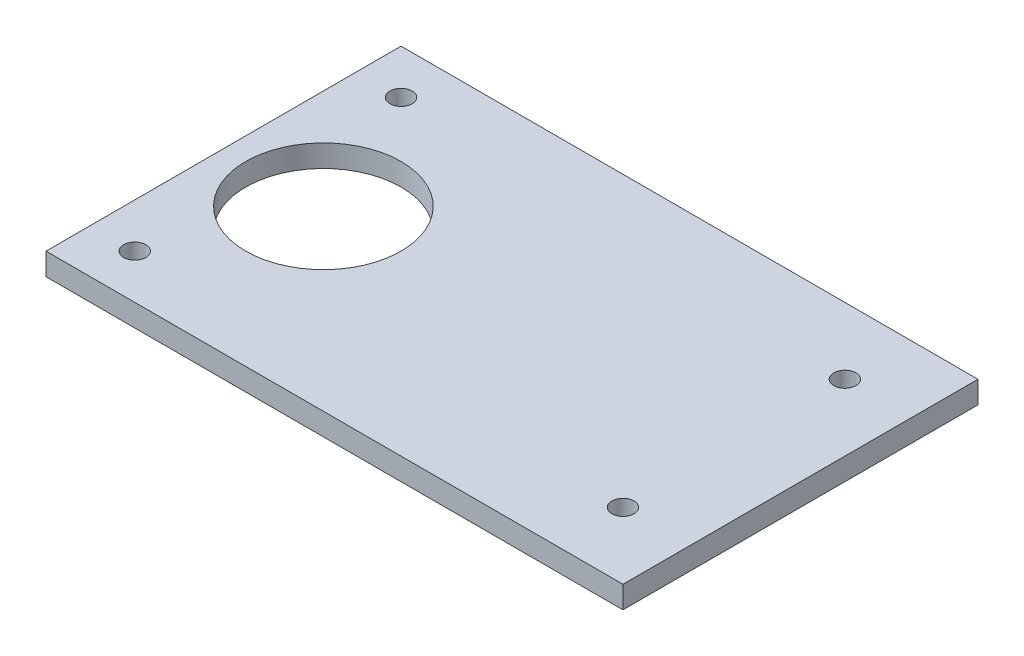
ISO-10303-21;
HEADER;
FILE_DESCRIPTION(('STEP AP214'),'2;1');
FILE_NAME('part.step','',(''),(''),'','','');
FILE_SCHEMA(('AUTOMOTIVE_DESIGN { 1 0 10303 214 1 1 1 1 }'));
ENDSEC;
DATA;
#1=APPLICATION_CONTEXT('core data for automotive mechanical design processes');
#2=APPLICATION_PROTOCOL_DEFINITION('international standard','automotive_design',2000,#1);
#3=PRODUCT_CONTEXT('',#1,'mechanical');
#4=PRODUCT('Part','Part','',(#3));
#5=PRODUCT_RELATED_PRODUCT_CATEGORY('part','',(#4));
#6=PRODUCT_DEFINITION_FORMATION('','',#4);
#7=PRODUCT_DEFINITION_CONTEXT('part definition',#1,'design');
#8=PRODUCT_DEFINITION('design','',#6,#7);
#9=PRODUCT_DEFINITION_SHAPE('','',#8);
#10=(LENGTH_UNIT() NAMED_UNIT(*) SI_UNIT(.MILLI.,.METRE.));
#11=(NAMED_UNIT(*) PLANE_ANGLE_UNIT() SI_UNIT($,.RADIAN.));
#12=(NAMED_UNIT(*) SI_UNIT($,.STERADIAN.) SOLID_ANGLE_UNIT());
#13=UNCERTAINTY_MEASURE_WITH_UNIT(LENGTH_MEASURE(1.E-05),#10,'distance_accuracy_value','');
#14=(GEOMETRIC_REPRESENTATION_CONTEXT(3) GLOBAL_UNCERTAINTY_ASSIGNED_CONTEXT((#13)) GLOBAL_UNIT_ASSIGNED_CONTEXT((#10,
#11,#12)) REPRESENTATION_CONTEXT('',''));
#15=CARTESIAN_POINT('',(0.,0.,0.));
#16=DIRECTION('',(0.,0.,1.));
#17=DIRECTION('',(1.,0.,0.));
#18=AXIS2_PLACEMENT_3D('',#15,#16,#17);
#19=CARTESIAN_POINT('',(0.,5.,0.));
#20=DIRECTION('',(0.,1.,0.));
#21=DIRECTION('',(0.,0.,1.));
#22=AXIS2_PLACEMENT_3D('',#19,#20,#21);
#23=PLANE('',#22);
#24=CARTESIAN_POINT('',(45.2816901408451,5.,30.3521126760564));
#25=DIRECTION('',(0.,1.,0.));
#26=DIRECTION('',(0.,0.,-1.));
#27=AXIS2_PLACEMENT_3D('',#24,#25,#26);
#28=CIRCLE('',#27,2.5);
#29=CARTESIAN_POINT('',(45.2816901408451,5.,27.8521126760563));
#30=VERTEX_POINT('',#29);
#31=EDGE_CURVE('E127',#30,#30,#28,.T.);
#32=ORIENTED_EDGE('',*,*,#31,.F.);
#33=EDGE_LOOP('',(#32));
#34=FACE_BOUND('',#33,.T.);
#35=CARTESIAN_POINT('',(45.2816901408451,5.,-19.6478873239437));
#36=DIRECTION('',(0.,1.,0.));
#37=DIRECTION('',(0.,0.,1.));
#38=AXIS2_PLACEMENT_3D('',#35,#36,#37);
#39=CIRCLE('',#38,2.5);
#40=CARTESIAN_POINT('',(45.2816901408451,5.,-17.1478873239436));
#41=VERTEX_POINT('',#40);
#42=EDGE_CURVE('E115',#41,#41,#39,.T.);
#43=ORIENTED_EDGE('',*,*,#42,.F.);
#44=EDGE_LOOP('',(#43));
#45=FACE_BOUND('',#44,.T.);
#46=DIRECTION('',(0.,0.,1.));
#47=VECTOR('',#46,1.);
#48=CARTESIAN_POINT('',(-69.7183098591549,5.,-34.6478873239436));
#49=LINE('',#48,#47);
#50=CARTESIAN_POINT('',(-69.7183098591549,5.,-34.6478873239436));
#51=VERTEX_POINT('',#50);
#52=CARTESIAN_POINT('',(-69.7183098591549,5.,45.3521126760564));
#53=VERTEX_POINT('',#52);
#54=EDGE_CURVE('E85',#51,#53,#49,.T.);
#55=ORIENTED_EDGE('',*,*,#54,.T.);
#56=DIRECTION('',(1.,0.,0.));
#57=VECTOR('',#56,1.);
#58=CARTESIAN_POINT('',(-69.7183098591549,5.,45.3521126760564));
#59=LINE('',#58,#57);
#60=CARTESIAN_POINT('',(60.2816901408451,5.,45.3521126760564));
#61=VERTEX_POINT('',#60);
#62=EDGE_CURVE('E80',#53,#61,#59,.T.);
#63=ORIENTED_EDGE('',*,*,#62,.T.);
#64=DIRECTION('',(0.,0.,-1.));
#65=VECTOR('',#64,1.);
#66=CARTESIAN_POINT('',(60.2816901408451,5.,-34.6478873239436));
#67=LINE('',#66,#65);
#68=CARTESIAN_POINT('',(60.2816901408451,5.,-34.6478873239436));
#69=VERTEX_POINT('',#68);
#70=EDGE_CURVE('E83',#61,#69,#67,.T.);
#71=ORIENTED_EDGE('',*,*,#70,.T.);
#72=DIRECTION('',(-1.,0.,0.));
#73=VECTOR('',#72,1.);
#74=CARTESIAN_POINT('',(-69.7183098591549,5.,-34.6478873239436));
#75=LINE('',#74,#73);
#76=EDGE_CURVE('E50',#69,#51,#75,.T.);
#77=ORIENTED_EDGE('',*,*,#76,.T.);
#78=EDGE_LOOP('',(#55,#63,#71,#77));
#79=FACE_BOUND('',#78,.T.);
#80=CARTESIAN_POINT('',(-47.2183098591549,5.,5.35211267605635));
#81=DIRECTION('',(0.,1.,0.));
#82=DIRECTION('',(0.,0.,1.));
#83=AXIS2_PLACEMENT_3D('',#80,#81,#82);
#84=CIRCLE('',#83,17.5);
#85=CARTESIAN_POINT('',(-47.2183098591549,5.,22.8521126760564));
#86=VERTEX_POINT('',#85);
#87=EDGE_CURVE('E100',#86,#86,#84,.T.);
#88=ORIENTED_EDGE('',*,*,#87,.F.);
#89=EDGE_LOOP('',(#88));
#90=FACE_BOUND('',#89,.T.);
#91=CARTESIAN_POINT('',(-59.7183098591549,5.,-24.6478873239436));
#92=DIRECTION('',(0.,1.,0.));
#93=DIRECTION('',(0.,0.,1.));
#94=AXIS2_PLACEMENT_3D('',#91,#92,#93);
#95=CIRCLE('',#94,2.5);
#96=CARTESIAN_POINT('',(-59.7183098591549,5.,-22.1478873239436));
#97=VERTEX_POINT('',#96);
#98=EDGE_CURVE('E121',#97,#97,#95,.T.);
#99=ORIENTED_EDGE('',*,*,#98,.F.);
#100=EDGE_LOOP('',(#99));
#101=FACE_BOUND('',#100,.T.);
#102=CARTESIAN_POINT('',(-59.7183098591549,5.,35.3521126760564));
#103=DIRECTION('',(0.,1.,0.));
#104=DIRECTION('',(0.,0.,-1.));
#105=AXIS2_PLACEMENT_3D('',#102,#103,#104);
#106=CIRCLE('',#105,2.5);
#107=CARTESIAN_POINT('',(-59.7183098591549,5.,32.8521126760563));
#108=VERTEX_POINT('',#107);
#109=EDGE_CURVE('E133',#108,#108,#106,.T.);
#110=ORIENTED_EDGE('',*,*,#109,.F.);
#111=EDGE_LOOP('',(#110));
#112=FACE_BOUND('',#111,.T.);
#113=ADVANCED_FACE('F33',(#34,#45,#79,#90,#101,#112),#23,.T.);
#114=CARTESIAN_POINT('',(0.,0.,0.));
#115=DIRECTION('',(0.,1.,0.));
#116=DIRECTION('',(0.,0.,1.));
#117=AXIS2_PLACEMENT_3D('',#114,#115,#116);
#118=PLANE('',#117);
#119=DIRECTION('',(0.,0.,1.));
#120=VECTOR('',#119,1.);
#121=CARTESIAN_POINT('',(-69.7183098591549,0.,-34.6478873239436));
#122=LINE('',#121,#120);
#123=CARTESIAN_POINT('',(-69.7183098591549,0.,-34.6478873239436));
#124=VERTEX_POINT('',#123);
#125=CARTESIAN_POINT('',(-69.7183098591549,0.,45.3521126760564));
#126=VERTEX_POINT('',#125);
#127=EDGE_CURVE('E97',#124,#126,#122,.T.);
#128=ORIENTED_EDGE('',*,*,#127,.F.);
#129=DIRECTION('',(-1.,0.,0.));
#130=VECTOR('',#129,1.);
#131=CARTESIAN_POINT('',(-69.7183098591549,0.,-34.6478873239436));
#132=LINE('',#131,#130);
#133=CARTESIAN_POINT('',(60.2816901408451,0.,-34.6478873239436));
#134=VERTEX_POINT('',#133);
#135=EDGE_CURVE('E73',#134,#124,#132,.T.);
#136=ORIENTED_EDGE('',*,*,#135,.F.);
#137=DIRECTION('',(0.,0.,-1.));
#138=VECTOR('',#137,1.);
#139=CARTESIAN_POINT('',(60.2816901408451,0.,-34.6478873239436));
#140=LINE('',#139,#138);
#141=CARTESIAN_POINT('',(60.2816901408451,0.,45.3521126760564));
#142=VERTEX_POINT('',#141);
#143=EDGE_CURVE('E67',#142,#134,#140,.T.);
#144=ORIENTED_EDGE('',*,*,#143,.F.);
#145=DIRECTION('',(1.,0.,0.));
#146=VECTOR('',#145,1.);
#147=CARTESIAN_POINT('',(-69.7183098591549,0.,45.3521126760564));
#148=LINE('',#147,#146);
#149=EDGE_CURVE('E89',#126,#142,#148,.T.);
#150=ORIENTED_EDGE('',*,*,#149,.F.);
#151=EDGE_LOOP('',(#128,#136,#144,#150));
#152=FACE_BOUND('',#151,.T.);
#153=CARTESIAN_POINT('',(-47.2183098591549,0.,5.35211267605635));
#154=DIRECTION('',(0.,1.,0.));
#155=DIRECTION('',(0.,0.,1.));
#156=AXIS2_PLACEMENT_3D('',#153,#154,#155);
#157=CIRCLE('',#156,17.5);
#158=CARTESIAN_POINT('',(-47.2183098591549,0.,22.8521126760564));
#159=VERTEX_POINT('',#158);
#160=EDGE_CURVE('E112',#159,#159,#157,.T.);
#161=ORIENTED_EDGE('',*,*,#160,.T.);
#162=EDGE_LOOP('',(#161));
#163=FACE_BOUND('',#162,.T.);
#164=CARTESIAN_POINT('',(45.2816901408451,0.,-19.6478873239437));
#165=DIRECTION('',(0.,1.,0.));
#166=DIRECTION('',(0.,0.,1.));
#167=AXIS2_PLACEMENT_3D('',#164,#165,#166);
#168=CIRCLE('',#167,2.5);
#169=CARTESIAN_POINT('',(45.2816901408451,0.,-17.1478873239436));
#170=VERTEX_POINT('',#169);
#171=EDGE_CURVE('E118',#170,#170,#168,.T.);
#172=ORIENTED_EDGE('',*,*,#171,.T.);
#173=EDGE_LOOP('',(#172));
#174=FACE_BOUND('',#173,.T.);
#175=CARTESIAN_POINT('',(-59.7183098591549,0.,-24.6478873239436));
#176=DIRECTION('',(0.,1.,0.));
#177=DIRECTION('',(0.,0.,1.));
#178=AXIS2_PLACEMENT_3D('',#175,#176,#177);
#179=CIRCLE('',#178,2.5);
#180=CARTESIAN_POINT('',(-59.7183098591549,0.,-22.1478873239436));
#181=VERTEX_POINT('',#180);
#182=EDGE_CURVE('E124',#181,#181,#179,.T.);
#183=ORIENTED_EDGE('',*,*,#182,.T.);
#184=EDGE_LOOP('',(#183));
#185=FACE_BOUND('',#184,.T.);
#186=CARTESIAN_POINT('',(45.2816901408451,0.,30.3521126760564));
#187=DIRECTION('',(0.,1.,0.));
#188=DIRECTION('',(0.,0.,-1.));
#189=AXIS2_PLACEMENT_3D('',#186,#187,#188);
#190=CIRCLE('',#189,2.5);
#191=CARTESIAN_POINT('',(45.2816901408451,0.,27.8521126760563));
#192=VERTEX_POINT('',#191);
#193=EDGE_CURVE('E130',#192,#192,#190,.T.);
#194=ORIENTED_EDGE('',*,*,#193,.T.);
#195=EDGE_LOOP('',(#194));
#196=FACE_BOUND('',#195,.T.);
#197=CARTESIAN_POINT('',(-59.7183098591549,0.,35.3521126760564));
#198=DIRECTION('',(0.,1.,0.));
#199=DIRECTION('',(0.,0.,-1.));
#200=AXIS2_PLACEMENT_3D('',#197,#198,#199);
#201=CIRCLE('',#200,2.5);
#202=CARTESIAN_POINT('',(-59.7183098591549,0.,32.8521126760563));
#203=VERTEX_POINT('',#202);
#204=EDGE_CURVE('E136',#203,#203,#201,.T.);
#205=ORIENTED_EDGE('',*,*,#204,.T.);
#206=EDGE_LOOP('',(#205));
#207=FACE_BOUND('',#206,.T.);
#208=ADVANCED_FACE('F108',(#152,#163,#174,#185,#196,#207),#118,.F.);
#209=CARTESIAN_POINT('',(-69.7183098591549,5.,-34.6478873239436));
#210=DIRECTION('',(1.,0.,0.));
#211=DIRECTION('',(0.,0.,-1.));
#212=AXIS2_PLACEMENT_3D('',#209,#210,#211);
#213=PLANE('',#212);
#214=ORIENTED_EDGE('',*,*,#127,.T.);
#215=DIRECTION('',(0.,-1.,0.));
#216=VECTOR('',#215,1.);
#217=CARTESIAN_POINT('',(-69.7183098591549,5.,45.3521126760564));
#218=LINE('',#217,#216);
#219=EDGE_CURVE('E11',#53,#126,#218,.T.);
#220=ORIENTED_EDGE('',*,*,#219,.F.);
#221=ORIENTED_EDGE('',*,*,#54,.F.);
#222=DIRECTION('',(0.,-1.,0.));
#223=VECTOR('',#222,1.);
#224=CARTESIAN_POINT('',(-69.7183098591549,5.,-34.6478873239436));
#225=LINE('',#224,#223);
#226=EDGE_CURVE('E93',#51,#124,#225,.T.);
#227=ORIENTED_EDGE('',*,*,#226,.T.);
#228=EDGE_LOOP('',(#214,#220,#221,#227));
#229=FACE_BOUND('',#228,.T.);
#230=ADVANCED_FACE('F35',(#229),#213,.F.);
#231=CARTESIAN_POINT('',(-69.7183098591549,5.,45.3521126760564));
#232=DIRECTION('',(0.,0.,-1.));
#233=DIRECTION('',(-1.,0.,0.));
#234=AXIS2_PLACEMENT_3D('',#231,#232,#233);
#235=PLANE('',#234);
#236=ORIENTED_EDGE('',*,*,#149,.T.);
#237=DIRECTION('',(0.,-1.,0.));
#238=VECTOR('',#237,1.);
#239=CARTESIAN_POINT('',(60.2816901408451,5.,45.3521126760564));
#240=LINE('',#239,#238);
#241=EDGE_CURVE('E42',#61,#142,#240,.T.);
#242=ORIENTED_EDGE('',*,*,#241,.F.);
#243=ORIENTED_EDGE('',*,*,#62,.F.);
#244=ORIENTED_EDGE('',*,*,#219,.T.);
#245=EDGE_LOOP('',(#236,#242,#243,#244));
#246=FACE_BOUND('',#245,.T.);
#247=ADVANCED_FACE('F88',(#246),#235,.F.);
#248=CARTESIAN_POINT('',(60.2816901408451,5.,-34.6478873239436));
#249=DIRECTION('',(-1.,0.,0.));
#250=DIRECTION('',(0.,0.,1.));
#251=AXIS2_PLACEMENT_3D('',#248,#249,#250);
#252=PLANE('',#251);
#253=ORIENTED_EDGE('',*,*,#143,.T.);
#254=DIRECTION('',(0.,-1.,0.));
#255=VECTOR('',#254,1.);
#256=CARTESIAN_POINT('',(60.2816901408451,5.,-34.6478873239436));
#257=LINE('',#256,#255);
#258=EDGE_CURVE('E90',#69,#134,#257,.T.);
#259=ORIENTED_EDGE('',*,*,#258,.F.);
#260=ORIENTED_EDGE('',*,*,#70,.F.);
#261=ORIENTED_EDGE('',*,*,#241,.T.);
#262=EDGE_LOOP('',(#253,#259,#260,#261));
#263=FACE_BOUND('',#262,.T.);
#264=ADVANCED_FACE('F91',(#263),#252,.F.);
#265=CARTESIAN_POINT('',(-69.7183098591549,5.,-34.6478873239436));
#266=DIRECTION('',(0.,0.,1.));
#267=DIRECTION('',(1.,0.,0.));
#268=AXIS2_PLACEMENT_3D('',#265,#266,#267);
#269=PLANE('',#268);
#270=ORIENTED_EDGE('',*,*,#135,.T.);
#271=ORIENTED_EDGE('',*,*,#226,.F.);
#272=ORIENTED_EDGE('',*,*,#76,.F.);
#273=ORIENTED_EDGE('',*,*,#258,.T.);
#274=EDGE_LOOP('',(#270,#271,#272,#273));
#275=FACE_BOUND('',#274,.T.);
#276=ADVANCED_FACE('F105',(#275),#269,.F.);
#277=CARTESIAN_POINT('',(-47.2183098591549,5.,5.35211267605635));
#278=DIRECTION('',(0.,-1.,0.));
#279=DIRECTION('',(0.,0.,-1.));
#280=AXIS2_PLACEMENT_3D('',#277,#278,#279);
#281=CYLINDRICAL_SURFACE('',#280,17.5);
#282=ORIENTED_EDGE('',*,*,#87,.T.);
#283=EDGE_LOOP('',(#282));
#284=FACE_BOUND('',#283,.T.);
#285=ORIENTED_EDGE('',*,*,#160,.F.);
#286=EDGE_LOOP('',(#285));
#287=FACE_BOUND('',#286,.T.);
#288=ADVANCED_FACE('F155',(#284,#287),#281,.F.);
#289=CARTESIAN_POINT('',(45.2816901408451,5.,-19.6478873239437));
#290=DIRECTION('',(0.,-1.,0.));
#291=DIRECTION('',(0.,0.,-1.));
#292=AXIS2_PLACEMENT_3D('',#289,#290,#291);
#293=CYLINDRICAL_SURFACE('',#292,2.5);
#294=ORIENTED_EDGE('',*,*,#42,.T.);
#295=EDGE_LOOP('',(#294));
#296=FACE_BOUND('',#295,.T.);
#297=ORIENTED_EDGE('',*,*,#171,.F.);
#298=EDGE_LOOP('',(#297));
#299=FACE_BOUND('',#298,.T.);
#300=ADVANCED_FACE('F201',(#296,#299),#293,.F.);
#301=CARTESIAN_POINT('',(-59.7183098591549,5.,-24.6478873239436));
#302=DIRECTION('',(0.,-1.,0.));
#303=DIRECTION('',(0.,0.,-1.));
#304=AXIS2_PLACEMENT_3D('',#301,#302,#303);
#305=CYLINDRICAL_SURFACE('',#304,2.5);
#306=ORIENTED_EDGE('',*,*,#98,.T.);
#307=EDGE_LOOP('',(#306));
#308=FACE_BOUND('',#307,.T.);
#309=ORIENTED_EDGE('',*,*,#182,.F.);
#310=EDGE_LOOP('',(#309));
#311=FACE_BOUND('',#310,.T.);
#312=ADVANCED_FACE('F209',(#308,#311),#305,.F.);
#313=CARTESIAN_POINT('',(45.2816901408451,5.,30.3521126760564));
#314=DIRECTION('',(0.,-1.,0.));
#315=DIRECTION('',(0.,0.,-1.));
#316=AXIS2_PLACEMENT_3D('',#313,#314,#315);
#317=CYLINDRICAL_SURFACE('',#316,2.5);
#318=ORIENTED_EDGE('',*,*,#31,.T.);
#319=EDGE_LOOP('',(#318));
#320=FACE_BOUND('',#319,.T.);
#321=ORIENTED_EDGE('',*,*,#193,.F.);
#322=EDGE_LOOP('',(#321));
#323=FACE_BOUND('',#322,.T.);
#324=ADVANCED_FACE('F217',(#320,#323),#317,.F.);
#325=CARTESIAN_POINT('',(-59.7183098591549,5.,35.3521126760564));
#326=DIRECTION('',(0.,-1.,0.));
#327=DIRECTION('',(0.,0.,-1.));
#328=AXIS2_PLACEMENT_3D('',#325,#326,#327);
#329=CYLINDRICAL_SURFACE('',#328,2.5);
#330=ORIENTED_EDGE('',*,*,#109,.T.);
#331=EDGE_LOOP('',(#330));
#332=FACE_BOUND('',#331,.T.);
#333=ORIENTED_EDGE('',*,*,#204,.F.);
#334=EDGE_LOOP('',(#333));
#335=FACE_BOUND('',#334,.T.);
#336=ADVANCED_FACE('F142',(#332,#335),#329,.F.);
#337=CLOSED_SHELL('',(#113,#208,#230,#247,#264,#276,#288,#300,#312,#324,#336));
#338=MANIFOLD_SOLID_BREP('B2',#337);
#339=ADVANCED_BREP_SHAPE_REPRESENTATION('',(#18,#338),#14);
#340=SHAPE_DEFINITION_REPRESENTATION(#9,#339);
ENDSEC;
END-ISO-10303-21;
